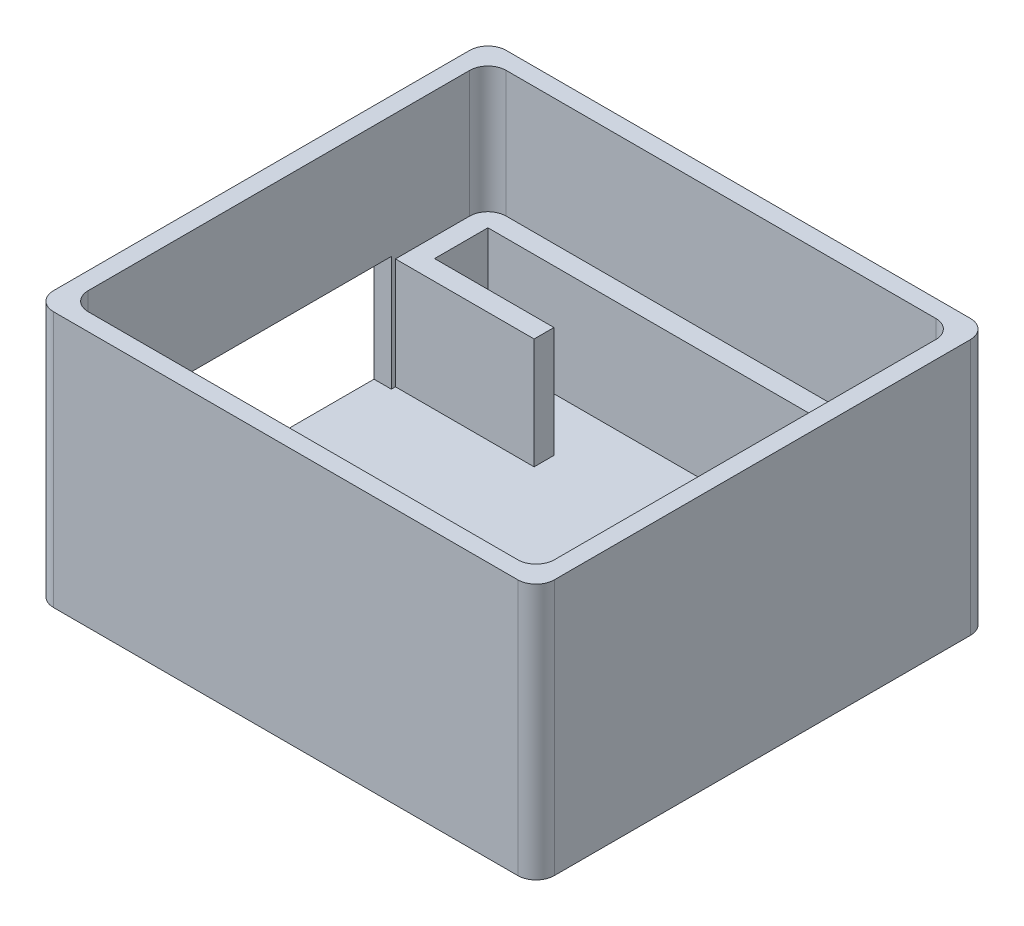
ISO-10303-21;
HEADER;
FILE_DESCRIPTION(('STEP AP214'),'2;1');
FILE_NAME('part.step','',(''),(''),'','','');
FILE_SCHEMA(('AUTOMOTIVE_DESIGN { 1 0 10303 214 1 1 1 1 }'));
ENDSEC;
DATA;
#1=APPLICATION_CONTEXT('core data for automotive mechanical design processes');
#2=APPLICATION_PROTOCOL_DEFINITION('international standard','automotive_design',2000,#1);
#3=PRODUCT_CONTEXT('',#1,'mechanical');
#4=PRODUCT('Part','Part','',(#3));
#5=PRODUCT_RELATED_PRODUCT_CATEGORY('part','',(#4));
#6=PRODUCT_DEFINITION_FORMATION('','',#4);
#7=PRODUCT_DEFINITION_CONTEXT('part definition',#1,'design');
#8=PRODUCT_DEFINITION('design','',#6,#7);
#9=PRODUCT_DEFINITION_SHAPE('','',#8);
#10=(LENGTH_UNIT() NAMED_UNIT(*) SI_UNIT(.MILLI.,.METRE.));
#11=(NAMED_UNIT(*) PLANE_ANGLE_UNIT() SI_UNIT($,.RADIAN.));
#12=(NAMED_UNIT(*) SI_UNIT($,.STERADIAN.) SOLID_ANGLE_UNIT());
#13=UNCERTAINTY_MEASURE_WITH_UNIT(LENGTH_MEASURE(1.E-05),#10,'distance_accuracy_value','');
#14=(GEOMETRIC_REPRESENTATION_CONTEXT(3) GLOBAL_UNCERTAINTY_ASSIGNED_CONTEXT((#13)) GLOBAL_UNIT_ASSIGNED_CONTEXT((#10,
#11,#12)) REPRESENTATION_CONTEXT('',''));
#15=CARTESIAN_POINT('',(0.,0.,0.));
#16=DIRECTION('',(0.,0.,1.));
#17=DIRECTION('',(1.,0.,0.));
#18=AXIS2_PLACEMENT_3D('',#15,#16,#17);
#19=CARTESIAN_POINT('',(0.,-2.3,0.));
#20=DIRECTION('',(0.,-1.,0.));
#21=DIRECTION('',(0.,0.,-1.));
#22=AXIS2_PLACEMENT_3D('',#19,#20,#21);
#23=PLANE('',#22);
#24=DIRECTION('',(1.,0.,0.));
#25=VECTOR('',#24,1.);
#26=CARTESIAN_POINT('',(0.,-2.3,-4.08189911136339));
#27=LINE('',#26,#25);
#28=CARTESIAN_POINT('',(-1.,-2.3,-4.08189911136339));
#29=VERTEX_POINT('',#28);
#30=CARTESIAN_POINT('',(7.1,-2.3,-4.08189911136339));
#31=VERTEX_POINT('',#30);
#32=EDGE_CURVE('E440',#29,#31,#27,.T.);
#33=ORIENTED_EDGE('',*,*,#32,.T.);
#34=DIRECTION('',(0.,0.,1.));
#35=VECTOR('',#34,1.);
#36=CARTESIAN_POINT('',(7.1,-2.3,-4.08189911136339));
#37=LINE('',#36,#35);
#38=CARTESIAN_POINT('',(7.1,-2.3,-3.08189911136339));
#39=VERTEX_POINT('',#38);
#40=EDGE_CURVE('E395',#31,#39,#37,.T.);
#41=ORIENTED_EDGE('',*,*,#40,.T.);
#42=DIRECTION('',(1.,0.,0.));
#43=VECTOR('',#42,1.);
#44=CARTESIAN_POINT('',(0.9,-2.3,-3.08189911136339));
#45=LINE('',#44,#43);
#46=CARTESIAN_POINT('',(0.9,-2.3,-3.08189911136339));
#47=VERTEX_POINT('',#46);
#48=EDGE_CURVE('E399',#47,#39,#45,.T.);
#49=ORIENTED_EDGE('',*,*,#48,.F.);
#50=DIRECTION('',(0.,0.,-1.));
#51=VECTOR('',#50,1.);
#52=CARTESIAN_POINT('',(0.9,-2.3,0.));
#53=LINE('',#52,#51);
#54=CARTESIAN_POINT('',(0.9,-2.3,-0.9));
#55=VERTEX_POINT('',#54);
#56=EDGE_CURVE('E551',#55,#47,#53,.T.);
#57=ORIENTED_EDGE('',*,*,#56,.F.);
#58=DIRECTION('',(1.,0.,0.));
#59=VECTOR('',#58,1.);
#60=CARTESIAN_POINT('',(0.,-2.3,-0.9));
#61=LINE('',#60,#59);
#62=CARTESIAN_POINT('',(23.1,-2.3,-0.9));
#63=VERTEX_POINT('',#62);
#64=EDGE_CURVE('E554',#55,#63,#61,.T.);
#65=ORIENTED_EDGE('',*,*,#64,.T.);
#66=DIRECTION('',(0.,0.,1.));
#67=VECTOR('',#66,1.);
#68=CARTESIAN_POINT('',(23.1,-2.3,0.));
#69=LINE('',#68,#67);
#70=CARTESIAN_POINT('',(23.1,-2.3,-20.6));
#71=VERTEX_POINT('',#70);
#72=EDGE_CURVE('E583',#71,#63,#69,.T.);
#73=ORIENTED_EDGE('',*,*,#72,.F.);
#74=DIRECTION('',(1.,0.,0.));
#75=VECTOR('',#74,1.);
#76=CARTESIAN_POINT('',(0.,-2.3,-20.6));
#77=LINE('',#76,#75);
#78=CARTESIAN_POINT('',(0.9,-2.3,-20.6));
#79=VERTEX_POINT('',#78);
#80=EDGE_CURVE('E581',#79,#71,#77,.T.);
#81=ORIENTED_EDGE('',*,*,#80,.F.);
#82=DIRECTION('',(0.,0.,1.));
#83=VECTOR('',#82,1.);
#84=CARTESIAN_POINT('',(0.9,-2.3,0.));
#85=LINE('',#84,#83);
#86=CARTESIAN_POINT('',(0.9,-2.3,-17.83));
#87=VERTEX_POINT('',#86);
#88=EDGE_CURVE('E578',#79,#87,#85,.T.);
#89=ORIENTED_EDGE('',*,*,#88,.T.);
#90=DIRECTION('',(1.,0.,0.));
#91=VECTOR('',#90,1.);
#92=CARTESIAN_POINT('',(0.9,-2.3,-17.83));
#93=LINE('',#92,#91);
#94=CARTESIAN_POINT('',(7.09724131044535,-2.3,-17.83));
#95=VERTEX_POINT('',#94);
#96=EDGE_CURVE('E382',#87,#95,#93,.T.);
#97=ORIENTED_EDGE('',*,*,#96,.T.);
#98=DIRECTION('',(0.,0.,-1.));
#99=VECTOR('',#98,1.);
#100=CARTESIAN_POINT('',(7.09724131044535,-2.3,-16.8));
#101=LINE('',#100,#99);
#102=CARTESIAN_POINT('',(7.09724131044535,-2.3,-16.8));
#103=VERTEX_POINT('',#102);
#104=EDGE_CURVE('E379',#103,#95,#101,.T.);
#105=ORIENTED_EDGE('',*,*,#104,.F.);
#106=DIRECTION('',(1.,0.,0.));
#107=VECTOR('',#106,1.);
#108=CARTESIAN_POINT('',(0.,-2.3,-16.8));
#109=LINE('',#108,#107);
#110=CARTESIAN_POINT('',(-0.1,-2.3,-16.8));
#111=VERTEX_POINT('',#110);
#112=EDGE_CURVE('E390',#111,#103,#109,.T.);
#113=ORIENTED_EDGE('',*,*,#112,.F.);
#114=DIRECTION('',(0.,0.,1.));
#115=VECTOR('',#114,1.);
#116=CARTESIAN_POINT('',(-0.1,-2.3,-21.6));
#117=LINE('',#116,#115);
#118=CARTESIAN_POINT('',(-0.1,-2.3,-16.586576073152));
#119=VERTEX_POINT('',#118);
#120=EDGE_CURVE('E365',#111,#119,#117,.T.);
#121=ORIENTED_EDGE('',*,*,#120,.T.);
#122=DIRECTION('',(-1.,0.,0.));
#123=VECTOR('',#122,1.);
#124=CARTESIAN_POINT('',(-1.,-2.3,-16.586576073152));
#125=LINE('',#124,#123);
#126=CARTESIAN_POINT('',(-1.,-2.3,-16.586576073152));
#127=VERTEX_POINT('',#126);
#128=EDGE_CURVE('E444',#119,#127,#125,.T.);
#129=ORIENTED_EDGE('',*,*,#128,.T.);
#130=DIRECTION('',(0.,0.,-1.));
#131=VECTOR('',#130,1.);
#132=CARTESIAN_POINT('',(-1.,-2.3,1.));
#133=LINE('',#132,#131);
#134=EDGE_CURVE('E427',#29,#127,#133,.T.);
#135=ORIENTED_EDGE('',*,*,#134,.F.);
#136=EDGE_LOOP('',(#33,#41,#49,#57,#65,#73,#81,#89,#97,#105,#113,#121,#129,#135));
#137=FACE_BOUND('',#136,.T.);
#138=ADVANCED_FACE('F135',(#137),#23,.F.);
#139=CARTESIAN_POINT('',(-0.1,-34.8043074068653,-21.6));
#140=DIRECTION('',(-1.,0.,0.));
#141=DIRECTION('',(0.,0.,1.));
#142=AXIS2_PLACEMENT_3D('',#139,#140,#141);
#143=PLANE('',#142);
#144=DIRECTION('',(0.,0.,1.));
#145=VECTOR('',#144,1.);
#146=CARTESIAN_POINT('',(-0.1,10.,-21.6));
#147=LINE('',#146,#145);
#148=CARTESIAN_POINT('',(-0.1,10.,-20.65));
#149=VERTEX_POINT('',#148);
#150=CARTESIAN_POINT('',(-0.1,10.,-0.85));
#151=VERTEX_POINT('',#150);
#152=EDGE_CURVE('E416',#149,#151,#147,.T.);
#153=ORIENTED_EDGE('',*,*,#152,.T.);
#154=DIRECTION('',(0.,1.,0.));
#155=VECTOR('',#154,1.);
#156=CARTESIAN_POINT('',(-0.1,3.45,-0.85));
#157=LINE('',#156,#155);
#158=CARTESIAN_POINT('',(-0.1,3.45,-0.85));
#159=VERTEX_POINT('',#158);
#160=EDGE_CURVE('E514',#151,#159,#157,.F.);
#161=ORIENTED_EDGE('',*,*,#160,.T.);
#162=DIRECTION('',(0.,0.,1.));
#163=VECTOR('',#162,1.);
#164=CARTESIAN_POINT('',(-0.1,3.45,0.));
#165=LINE('',#164,#163);
#166=CARTESIAN_POINT('',(-0.1,3.45,-4.08189911136339));
#167=VERTEX_POINT('',#166);
#168=EDGE_CURVE('E571',#167,#159,#165,.T.);
#169=ORIENTED_EDGE('',*,*,#168,.F.);
#170=DIRECTION('',(0.,-1.,0.));
#171=VECTOR('',#170,1.);
#172=CARTESIAN_POINT('',(-0.1,0.,-4.08189911136339));
#173=LINE('',#172,#171);
#174=CARTESIAN_POINT('',(-0.1,3.66933462960635,-4.08189911136339));
#175=VERTEX_POINT('',#174);
#176=EDGE_CURVE('E410',#175,#167,#173,.T.);
#177=ORIENTED_EDGE('',*,*,#176,.F.);
#178=DIRECTION('',(0.,0.,1.));
#179=VECTOR('',#178,1.);
#180=CARTESIAN_POINT('',(-0.1,3.66933462960635,-16.586576073152));
#181=LINE('',#180,#179);
#182=CARTESIAN_POINT('',(-0.1,3.66933462960635,-16.586576073152));
#183=VERTEX_POINT('',#182);
#184=EDGE_CURVE('E421',#183,#175,#181,.T.);
#185=ORIENTED_EDGE('',*,*,#184,.F.);
#186=DIRECTION('',(0.,1.,0.));
#187=VECTOR('',#186,1.);
#188=CARTESIAN_POINT('',(-0.1,0.,-16.586576073152));
#189=LINE('',#188,#187);
#190=EDGE_CURVE('E424',#119,#183,#189,.T.);
#191=ORIENTED_EDGE('',*,*,#190,.F.);
#192=ORIENTED_EDGE('',*,*,#120,.F.);
#193=DIRECTION('',(0.,-1.,0.));
#194=VECTOR('',#193,1.);
#195=CARTESIAN_POINT('',(-0.1,3.45,-16.8));
#196=LINE('',#195,#194);
#197=CARTESIAN_POINT('',(-0.1,3.45,-16.8));
#198=VERTEX_POINT('',#197);
#199=EDGE_CURVE('E354',#198,#111,#196,.T.);
#200=ORIENTED_EDGE('',*,*,#199,.F.);
#201=DIRECTION('',(0.,0.,1.));
#202=VECTOR('',#201,1.);
#203=CARTESIAN_POINT('',(-0.1,3.45,0.));
#204=LINE('',#203,#202);
#205=CARTESIAN_POINT('',(-0.1,3.45,-20.65));
#206=VERTEX_POINT('',#205);
#207=EDGE_CURVE('E337',#206,#198,#204,.T.);
#208=ORIENTED_EDGE('',*,*,#207,.F.);
#209=DIRECTION('',(0.,1.,0.));
#210=VECTOR('',#209,1.);
#211=CARTESIAN_POINT('',(-0.1,10.,-20.65));
#212=LINE('',#211,#210);
#213=EDGE_CURVE('E512',#206,#149,#212,.T.);
#214=ORIENTED_EDGE('',*,*,#213,.T.);
#215=EDGE_LOOP('',(#153,#161,#169,#177,#185,#191,#192,#200,#208,#214));
#216=FACE_BOUND('',#215,.T.);
#217=ADVANCED_FACE('F363',(#216),#143,.F.);
#218=CARTESIAN_POINT('',(0.,10.,0.));
#219=DIRECTION('',(0.,1.,0.));
#220=DIRECTION('',(0.,0.,1.));
#221=AXIS2_PLACEMENT_3D('',#218,#219,#220);
#222=PLANE('',#221);
#223=ORIENTED_EDGE('',*,*,#152,.F.);
#224=CARTESIAN_POINT('',(0.85,10.,-20.65));
#225=DIRECTION('',(0.,1.,0.));
#226=DIRECTION('',(0.,0.,1.));
#227=AXIS2_PLACEMENT_3D('',#224,#225,#226);
#228=CIRCLE('',#227,0.95);
#229=CARTESIAN_POINT('',(0.85,10.,-21.6));
#230=VERTEX_POINT('',#229);
#231=EDGE_CURVE('E12',#149,#230,#228,.F.);
#232=ORIENTED_EDGE('',*,*,#231,.T.);
#233=DIRECTION('',(-1.,0.,0.));
#234=VECTOR('',#233,1.);
#235=CARTESIAN_POINT('',(-0.1,10.,-21.6));
#236=LINE('',#235,#234);
#237=CARTESIAN_POINT('',(23.15,10.,-21.6));
#238=VERTEX_POINT('',#237);
#239=EDGE_CURVE('E407',#238,#230,#236,.T.);
#240=ORIENTED_EDGE('',*,*,#239,.F.);
#241=CARTESIAN_POINT('',(23.15,10.,-20.65));
#242=DIRECTION('',(0.,1.,0.));
#243=DIRECTION('',(0.,0.,1.));
#244=AXIS2_PLACEMENT_3D('',#241,#242,#243);
#245=CIRCLE('',#244,0.95);
#246=CARTESIAN_POINT('',(24.1,10.,-20.65));
#247=VERTEX_POINT('',#246);
#248=EDGE_CURVE('E143',#238,#247,#245,.F.);
#249=ORIENTED_EDGE('',*,*,#248,.T.);
#250=DIRECTION('',(0.,0.,-1.));
#251=VECTOR('',#250,1.);
#252=CARTESIAN_POINT('',(24.1,10.,-21.6));
#253=LINE('',#252,#251);
#254=CARTESIAN_POINT('',(24.1,10.,-0.85));
#255=VERTEX_POINT('',#254);
#256=EDGE_CURVE('E411',#255,#247,#253,.T.);
#257=ORIENTED_EDGE('',*,*,#256,.F.);
#258=CARTESIAN_POINT('',(23.15,10.,-0.85));
#259=DIRECTION('',(0.,1.,0.));
#260=DIRECTION('',(0.,0.,1.));
#261=AXIS2_PLACEMENT_3D('',#258,#259,#260);
#262=CIRCLE('',#261,0.95);
#263=CARTESIAN_POINT('',(23.15,10.,0.1));
#264=VERTEX_POINT('',#263);
#265=EDGE_CURVE('E533',#255,#264,#262,.F.);
#266=ORIENTED_EDGE('',*,*,#265,.T.);
#267=DIRECTION('',(1.,0.,0.));
#268=VECTOR('',#267,1.);
#269=CARTESIAN_POINT('',(-0.1,10.,0.1));
#270=LINE('',#269,#268);
#271=CARTESIAN_POINT('',(0.85,10.,0.1));
#272=VERTEX_POINT('',#271);
#273=EDGE_CURVE('E413',#272,#264,#270,.T.);
#274=ORIENTED_EDGE('',*,*,#273,.F.);
#275=CARTESIAN_POINT('',(0.85,10.,-0.85));
#276=DIRECTION('',(0.,1.,0.));
#277=DIRECTION('',(0.,0.,1.));
#278=AXIS2_PLACEMENT_3D('',#275,#276,#277);
#279=CIRCLE('',#278,0.95);
#280=EDGE_CURVE('E531',#272,#151,#279,.F.);
#281=ORIENTED_EDGE('',*,*,#280,.T.);
#282=EDGE_LOOP('',(#223,#232,#240,#249,#257,#266,#274,#281));
#283=FACE_BOUND('',#282,.T.);
#284=DIRECTION('',(1.,0.,0.));
#285=VECTOR('',#284,1.);
#286=CARTESIAN_POINT('',(-1.,10.,1.));
#287=LINE('',#286,#285);
#288=CARTESIAN_POINT('',(-0.05,10.,1.));
#289=VERTEX_POINT('',#288);
#290=CARTESIAN_POINT('',(24.05,10.,1.));
#291=VERTEX_POINT('',#290);
#292=EDGE_CURVE('E462',#289,#291,#287,.T.);
#293=ORIENTED_EDGE('',*,*,#292,.T.);
#294=CARTESIAN_POINT('',(24.05,10.,0.0500000000000014));
#295=DIRECTION('',(0.,1.,0.));
#296=DIRECTION('',(0.,0.,1.));
#297=AXIS2_PLACEMENT_3D('',#294,#295,#296);
#298=CIRCLE('',#297,0.95);
#299=CARTESIAN_POINT('',(25.,10.,0.0500000000000014));
#300=VERTEX_POINT('',#299);
#301=EDGE_CURVE('E495',#291,#300,#298,.T.);
#302=ORIENTED_EDGE('',*,*,#301,.T.);
#303=DIRECTION('',(0.,0.,-1.));
#304=VECTOR('',#303,1.);
#305=CARTESIAN_POINT('',(25.,10.,-22.5));
#306=LINE('',#305,#304);
#307=CARTESIAN_POINT('',(25.,10.,-21.55));
#308=VERTEX_POINT('',#307);
#309=EDGE_CURVE('E465',#300,#308,#306,.T.);
#310=ORIENTED_EDGE('',*,*,#309,.T.);
#311=CARTESIAN_POINT('',(24.05,10.,-21.55));
#312=DIRECTION('',(0.,1.,0.));
#313=DIRECTION('',(0.,0.,1.));
#314=AXIS2_PLACEMENT_3D('',#311,#312,#313);
#315=CIRCLE('',#314,0.95);
#316=CARTESIAN_POINT('',(24.05,10.,-22.5));
#317=VERTEX_POINT('',#316);
#318=EDGE_CURVE('E493',#308,#317,#315,.T.);
#319=ORIENTED_EDGE('',*,*,#318,.T.);
#320=DIRECTION('',(-1.,0.,0.));
#321=VECTOR('',#320,1.);
#322=CARTESIAN_POINT('',(-1.,10.,-22.5));
#323=LINE('',#322,#321);
#324=CARTESIAN_POINT('',(-0.05,10.,-22.5));
#325=VERTEX_POINT('',#324);
#326=EDGE_CURVE('E468',#317,#325,#323,.T.);
#327=ORIENTED_EDGE('',*,*,#326,.T.);
#328=CARTESIAN_POINT('',(-0.05,10.,-21.55));
#329=DIRECTION('',(0.,1.,0.));
#330=DIRECTION('',(0.,0.,1.));
#331=AXIS2_PLACEMENT_3D('',#328,#329,#330);
#332=CIRCLE('',#331,0.95);
#333=CARTESIAN_POINT('',(-1.,10.,-21.55));
#334=VERTEX_POINT('',#333);
#335=EDGE_CURVE('E491',#325,#334,#332,.T.);
#336=ORIENTED_EDGE('',*,*,#335,.T.);
#337=DIRECTION('',(0.,0.,1.));
#338=VECTOR('',#337,1.);
#339=CARTESIAN_POINT('',(-1.,10.,-22.5));
#340=LINE('',#339,#338);
#341=CARTESIAN_POINT('',(-1.,10.,0.0500000000000014));
#342=VERTEX_POINT('',#341);
#343=EDGE_CURVE('E458',#334,#342,#340,.T.);
#344=ORIENTED_EDGE('',*,*,#343,.T.);
#345=CARTESIAN_POINT('',(-0.05,10.,0.05));
#346=DIRECTION('',(0.,1.,0.));
#347=DIRECTION('',(0.,0.,1.));
#348=AXIS2_PLACEMENT_3D('',#345,#346,#347);
#349=CIRCLE('',#348,0.95);
#350=EDGE_CURVE('E489',#342,#289,#349,.T.);
#351=ORIENTED_EDGE('',*,*,#350,.T.);
#352=EDGE_LOOP('',(#293,#302,#310,#319,#327,#336,#344,#351));
#353=FACE_BOUND('',#352,.T.);
#354=ADVANCED_FACE('F538',(#283,#353),#222,.T.);
#355=CARTESIAN_POINT('',(-1.,10.,-22.5));
#356=DIRECTION('',(1.,0.,0.));
#357=DIRECTION('',(0.,0.,-1.));
#358=AXIS2_PLACEMENT_3D('',#355,#356,#357);
#359=PLANE('',#358);
#360=ORIENTED_EDGE('',*,*,#343,.F.);
#361=DIRECTION('',(0.,-1.,0.));
#362=VECTOR('',#361,1.);
#363=CARTESIAN_POINT('',(-1.,10.,-21.55));
#364=LINE('',#363,#362);
#365=CARTESIAN_POINT('',(-1.,-3.3,-21.55));
#366=VERTEX_POINT('',#365);
#367=EDGE_CURVE('E504',#334,#366,#364,.T.);
#368=ORIENTED_EDGE('',*,*,#367,.T.);
#369=DIRECTION('',(0.,0.,-1.));
#370=VECTOR('',#369,1.);
#371=CARTESIAN_POINT('',(-1.,-3.3,1.));
#372=LINE('',#371,#370);
#373=CARTESIAN_POINT('',(-1.,-3.3,0.05));
#374=VERTEX_POINT('',#373);
#375=EDGE_CURVE('E428',#374,#366,#372,.T.);
#376=ORIENTED_EDGE('',*,*,#375,.F.);
#377=DIRECTION('',(0.,-1.,0.));
#378=VECTOR('',#377,1.);
#379=CARTESIAN_POINT('',(-1.,10.,0.0500000000000014));
#380=LINE('',#379,#378);
#381=EDGE_CURVE('E502',#374,#342,#380,.F.);
#382=ORIENTED_EDGE('',*,*,#381,.T.);
#383=EDGE_LOOP('',(#360,#368,#376,#382));
#384=FACE_BOUND('',#383,.T.);
#385=ORIENTED_EDGE('',*,*,#134,.T.);
#386=DIRECTION('',(0.,-1.,0.));
#387=VECTOR('',#386,1.);
#388=CARTESIAN_POINT('',(-1.,0.,-16.586576073152));
#389=LINE('',#388,#387);
#390=CARTESIAN_POINT('',(-1.,3.66933462960635,-16.586576073152));
#391=VERTEX_POINT('',#390);
#392=EDGE_CURVE('E446',#391,#127,#389,.T.);
#393=ORIENTED_EDGE('',*,*,#392,.F.);
#394=DIRECTION('',(0.,0.,-1.));
#395=VECTOR('',#394,1.);
#396=CARTESIAN_POINT('',(-1.,3.66933462960635,-16.586576073152));
#397=LINE('',#396,#395);
#398=CARTESIAN_POINT('',(-1.,3.66933462960635,-4.08189911136339));
#399=VERTEX_POINT('',#398);
#400=EDGE_CURVE('E452',#399,#391,#397,.T.);
#401=ORIENTED_EDGE('',*,*,#400,.F.);
#402=DIRECTION('',(0.,1.,0.));
#403=VECTOR('',#402,1.);
#404=CARTESIAN_POINT('',(-1.,0.,-4.08189911136339));
#405=LINE('',#404,#403);
#406=EDGE_CURVE('E449',#29,#399,#405,.T.);
#407=ORIENTED_EDGE('',*,*,#406,.F.);
#408=EDGE_LOOP('',(#385,#393,#401,#407));
#409=FACE_BOUND('',#408,.T.);
#410=ADVANCED_FACE('F664',(#384,#409),#359,.F.);
#411=CARTESIAN_POINT('',(-1.,10.,1.));
#412=DIRECTION('',(0.,0.,-1.));
#413=DIRECTION('',(-1.,0.,0.));
#414=AXIS2_PLACEMENT_3D('',#411,#412,#413);
#415=PLANE('',#414);
#416=DIRECTION('',(-1.,0.,0.));
#417=VECTOR('',#416,1.);
#418=CARTESIAN_POINT('',(-1.,-3.3,1.));
#419=LINE('',#418,#417);
#420=CARTESIAN_POINT('',(24.05,-3.3,1.));
#421=VERTEX_POINT('',#420);
#422=CARTESIAN_POINT('',(-0.05,-3.3,1.));
#423=VERTEX_POINT('',#422);
#424=EDGE_CURVE('E437',#421,#423,#419,.T.);
#425=ORIENTED_EDGE('',*,*,#424,.F.);
#426=DIRECTION('',(0.,-1.,0.));
#427=VECTOR('',#426,1.);
#428=CARTESIAN_POINT('',(24.05,10.,1.));
#429=LINE('',#428,#427);
#430=EDGE_CURVE('E487',#421,#291,#429,.F.);
#431=ORIENTED_EDGE('',*,*,#430,.T.);
#432=ORIENTED_EDGE('',*,*,#292,.F.);
#433=DIRECTION('',(0.,-1.,0.));
#434=VECTOR('',#433,1.);
#435=CARTESIAN_POINT('',(-0.05,10.,1.));
#436=LINE('',#435,#434);
#437=EDGE_CURVE('E484',#289,#423,#436,.T.);
#438=ORIENTED_EDGE('',*,*,#437,.T.);
#439=EDGE_LOOP('',(#425,#431,#432,#438));
#440=FACE_BOUND('',#439,.T.);
#441=ADVANCED_FACE('F671',(#440),#415,.F.);
#442=CARTESIAN_POINT('',(25.,10.,-22.5));
#443=DIRECTION('',(-1.,0.,0.));
#444=DIRECTION('',(0.,0.,1.));
#445=AXIS2_PLACEMENT_3D('',#442,#443,#444);
#446=PLANE('',#445);
#447=ORIENTED_EDGE('',*,*,#309,.F.);
#448=DIRECTION('',(0.,-1.,0.));
#449=VECTOR('',#448,1.);
#450=CARTESIAN_POINT('',(25.,10.,0.0500000000000014));
#451=LINE('',#450,#449);
#452=CARTESIAN_POINT('',(25.,-3.3,0.0500000000000014));
#453=VERTEX_POINT('',#452);
#454=EDGE_CURVE('E473',#300,#453,#451,.T.);
#455=ORIENTED_EDGE('',*,*,#454,.T.);
#456=DIRECTION('',(0.,0.,1.));
#457=VECTOR('',#456,1.);
#458=CARTESIAN_POINT('',(25.,-3.3,1.));
#459=LINE('',#458,#457);
#460=CARTESIAN_POINT('',(25.,-3.3,-21.55));
#461=VERTEX_POINT('',#460);
#462=EDGE_CURVE('E434',#461,#453,#459,.T.);
#463=ORIENTED_EDGE('',*,*,#462,.F.);
#464=DIRECTION('',(0.,-1.,0.));
#465=VECTOR('',#464,1.);
#466=CARTESIAN_POINT('',(25.,10.,-21.55));
#467=LINE('',#466,#465);
#468=EDGE_CURVE('E471',#461,#308,#467,.F.);
#469=ORIENTED_EDGE('',*,*,#468,.T.);
#470=EDGE_LOOP('',(#447,#455,#463,#469));
#471=FACE_BOUND('',#470,.T.);
#472=ADVANCED_FACE('F667',(#471),#446,.F.);
#473=CARTESIAN_POINT('',(-1.,10.,-22.5));
#474=DIRECTION('',(0.,0.,1.));
#475=DIRECTION('',(1.,0.,0.));
#476=AXIS2_PLACEMENT_3D('',#473,#474,#475);
#477=PLANE('',#476);
#478=ORIENTED_EDGE('',*,*,#326,.F.);
#479=DIRECTION('',(0.,-1.,0.));
#480=VECTOR('',#479,1.);
#481=CARTESIAN_POINT('',(24.05,10.,-22.5));
#482=LINE('',#481,#480);
#483=CARTESIAN_POINT('',(24.05,-3.3,-22.5));
#484=VERTEX_POINT('',#483);
#485=EDGE_CURVE('E499',#317,#484,#482,.T.);
#486=ORIENTED_EDGE('',*,*,#485,.T.);
#487=DIRECTION('',(1.,0.,0.));
#488=VECTOR('',#487,1.);
#489=CARTESIAN_POINT('',(-1.,-3.3,-22.5));
#490=LINE('',#489,#488);
#491=CARTESIAN_POINT('',(-0.05,-3.3,-22.5));
#492=VERTEX_POINT('',#491);
#493=EDGE_CURVE('E431',#492,#484,#490,.T.);
#494=ORIENTED_EDGE('',*,*,#493,.F.);
#495=DIRECTION('',(0.,-1.,0.));
#496=VECTOR('',#495,1.);
#497=CARTESIAN_POINT('',(-0.05,10.,-22.5));
#498=LINE('',#497,#496);
#499=EDGE_CURVE('E497',#492,#325,#498,.F.);
#500=ORIENTED_EDGE('',*,*,#499,.T.);
#501=EDGE_LOOP('',(#478,#486,#494,#500));
#502=FACE_BOUND('',#501,.T.);
#503=ADVANCED_FACE('F660',(#502),#477,.F.);
#504=CARTESIAN_POINT('',(0.,0.,-16.586576073152));
#505=DIRECTION('',(0.,0.,-1.));
#506=DIRECTION('',(-1.,0.,0.));
#507=AXIS2_PLACEMENT_3D('',#504,#505,#506);
#508=PLANE('',#507);
#509=ORIENTED_EDGE('',*,*,#128,.F.);
#510=ORIENTED_EDGE('',*,*,#190,.T.);
#511=DIRECTION('',(-1.,0.,0.));
#512=VECTOR('',#511,1.);
#513=CARTESIAN_POINT('',(0.,3.66933462960635,-16.586576073152));
#514=LINE('',#513,#512);
#515=EDGE_CURVE('E456',#183,#391,#514,.T.);
#516=ORIENTED_EDGE('',*,*,#515,.T.);
#517=ORIENTED_EDGE('',*,*,#392,.T.);
#518=EDGE_LOOP('',(#509,#510,#516,#517));
#519=FACE_BOUND('',#518,.T.);
#520=ADVANCED_FACE('F653',(#519),#508,.F.);
#521=CARTESIAN_POINT('',(0.,3.66933462960635,-16.586576073152));
#522=DIRECTION('',(0.,1.,0.));
#523=DIRECTION('',(0.,0.,1.));
#524=AXIS2_PLACEMENT_3D('',#521,#522,#523);
#525=PLANE('',#524);
#526=ORIENTED_EDGE('',*,*,#515,.F.);
#527=ORIENTED_EDGE('',*,*,#184,.T.);
#528=DIRECTION('',(-1.,0.,0.));
#529=VECTOR('',#528,1.);
#530=CARTESIAN_POINT('',(0.,3.66933462960635,-4.08189911136339));
#531=LINE('',#530,#529);
#532=EDGE_CURVE('E455',#175,#399,#531,.T.);
#533=ORIENTED_EDGE('',*,*,#532,.T.);
#534=ORIENTED_EDGE('',*,*,#400,.T.);
#535=EDGE_LOOP('',(#526,#527,#533,#534));
#536=FACE_BOUND('',#535,.T.);
#537=ADVANCED_FACE('F649',(#536),#525,.F.);
#538=CARTESIAN_POINT('',(0.,0.,-4.08189911136339));
#539=DIRECTION('',(0.,0.,1.));
#540=DIRECTION('',(1.,0.,0.));
#541=AXIS2_PLACEMENT_3D('',#538,#539,#540);
#542=PLANE('',#541);
#543=ORIENTED_EDGE('',*,*,#532,.F.);
#544=ORIENTED_EDGE('',*,*,#176,.T.);
#545=DIRECTION('',(-1.,0.,0.));
#546=VECTOR('',#545,1.);
#547=CARTESIAN_POINT('',(0.,3.45,-4.08189911136339));
#548=LINE('',#547,#546);
#549=CARTESIAN_POINT('',(7.1,3.45,-4.08189911136339));
#550=VERTEX_POINT('',#549);
#551=EDGE_CURVE('E569',#550,#167,#548,.T.);
#552=ORIENTED_EDGE('',*,*,#551,.F.);
#553=DIRECTION('',(0.,-1.,0.));
#554=VECTOR('',#553,1.);
#555=CARTESIAN_POINT('',(7.1,3.45,-4.08189911136339));
#556=LINE('',#555,#554);
#557=EDGE_CURVE('E398',#550,#31,#556,.T.);
#558=ORIENTED_EDGE('',*,*,#557,.T.);
#559=ORIENTED_EDGE('',*,*,#32,.F.);
#560=ORIENTED_EDGE('',*,*,#406,.T.);
#561=EDGE_LOOP('',(#543,#544,#552,#558,#559,#560));
#562=FACE_BOUND('',#561,.T.);
#563=ADVANCED_FACE('F652',(#562),#542,.F.);
#564=CARTESIAN_POINT('',(0.,-3.3,0.));
#565=DIRECTION('',(0.,-1.,0.));
#566=DIRECTION('',(0.,0.,-1.));
#567=AXIS2_PLACEMENT_3D('',#564,#565,#566);
#568=PLANE('',#567);
#569=ORIENTED_EDGE('',*,*,#462,.T.);
#570=CARTESIAN_POINT('',(24.05,-3.3,0.0500000000000014));
#571=DIRECTION('',(0.,-1.,0.));
#572=DIRECTION('',(0.,0.,-1.));
#573=AXIS2_PLACEMENT_3D('',#570,#571,#572);
#574=CIRCLE('',#573,0.95);
#575=EDGE_CURVE('E482',#453,#421,#574,.T.);
#576=ORIENTED_EDGE('',*,*,#575,.T.);
#577=ORIENTED_EDGE('',*,*,#424,.T.);
#578=CARTESIAN_POINT('',(-0.05,-3.3,0.05));
#579=DIRECTION('',(0.,-1.,0.));
#580=DIRECTION('',(0.,0.,-1.));
#581=AXIS2_PLACEMENT_3D('',#578,#579,#580);
#582=CIRCLE('',#581,0.95);
#583=EDGE_CURVE('E476',#423,#374,#582,.T.);
#584=ORIENTED_EDGE('',*,*,#583,.T.);
#585=ORIENTED_EDGE('',*,*,#375,.T.);
#586=CARTESIAN_POINT('',(-0.05,-3.3,-21.55));
#587=DIRECTION('',(0.,-1.,0.));
#588=DIRECTION('',(0.,0.,-1.));
#589=AXIS2_PLACEMENT_3D('',#586,#587,#588);
#590=CIRCLE('',#589,0.95);
#591=EDGE_CURVE('E478',#366,#492,#590,.T.);
#592=ORIENTED_EDGE('',*,*,#591,.T.);
#593=ORIENTED_EDGE('',*,*,#493,.T.);
#594=CARTESIAN_POINT('',(24.05,-3.3,-21.55));
#595=DIRECTION('',(0.,-1.,0.));
#596=DIRECTION('',(0.,0.,-1.));
#597=AXIS2_PLACEMENT_3D('',#594,#595,#596);
#598=CIRCLE('',#597,0.95);
#599=EDGE_CURVE('E480',#484,#461,#598,.T.);
#600=ORIENTED_EDGE('',*,*,#599,.T.);
#601=EDGE_LOOP('',(#569,#576,#577,#584,#585,#592,#593,#600));
#602=FACE_BOUND('',#601,.T.);
#603=ADVANCED_FACE('F648',(#602),#568,.T.);
#604=CARTESIAN_POINT('',(-0.1,-34.8043074068653,-21.6));
#605=DIRECTION('',(0.,0.,-1.));
#606=DIRECTION('',(-1.,0.,0.));
#607=AXIS2_PLACEMENT_3D('',#604,#605,#606);
#608=PLANE('',#607);
#609=DIRECTION('',(-1.,0.,0.));
#610=VECTOR('',#609,1.);
#611=CARTESIAN_POINT('',(0.,3.45,-21.6));
#612=LINE('',#611,#610);
#613=CARTESIAN_POINT('',(23.15,3.45,-21.6));
#614=VERTEX_POINT('',#613);
#615=CARTESIAN_POINT('',(0.85,3.45,-21.6));
#616=VERTEX_POINT('',#615);
#617=EDGE_CURVE('E350',#614,#616,#612,.T.);
#618=ORIENTED_EDGE('',*,*,#617,.F.);
#619=DIRECTION('',(0.,1.,0.));
#620=VECTOR('',#619,1.);
#621=CARTESIAN_POINT('',(23.15,10.,-21.6));
#622=LINE('',#621,#620);
#623=EDGE_CURVE('E528',#614,#238,#622,.T.);
#624=ORIENTED_EDGE('',*,*,#623,.T.);
#625=ORIENTED_EDGE('',*,*,#239,.T.);
#626=DIRECTION('',(0.,1.,0.));
#627=VECTOR('',#626,1.);
#628=CARTESIAN_POINT('',(0.85,3.45,-21.6));
#629=LINE('',#628,#627);
#630=EDGE_CURVE('E526',#230,#616,#629,.F.);
#631=ORIENTED_EDGE('',*,*,#630,.T.);
#632=EDGE_LOOP('',(#618,#624,#625,#631));
#633=FACE_BOUND('',#632,.T.);
#634=ADVANCED_FACE('F549',(#633),#608,.F.);
#635=CARTESIAN_POINT('',(24.1,-34.8043074068653,-21.6));
#636=DIRECTION('',(1.,0.,0.));
#637=DIRECTION('',(0.,0.,-1.));
#638=AXIS2_PLACEMENT_3D('',#635,#636,#637);
#639=PLANE('',#638);
#640=DIRECTION('',(0.,0.,-1.));
#641=VECTOR('',#640,1.);
#642=CARTESIAN_POINT('',(24.1,3.45,0.));
#643=LINE('',#642,#641);
#644=CARTESIAN_POINT('',(24.1,3.45,-0.85));
#645=VERTEX_POINT('',#644);
#646=CARTESIAN_POINT('',(24.1,3.45,-20.65));
#647=VERTEX_POINT('',#646);
#648=EDGE_CURVE('E547',#645,#647,#643,.T.);
#649=ORIENTED_EDGE('',*,*,#648,.F.);
#650=DIRECTION('',(0.,1.,0.));
#651=VECTOR('',#650,1.);
#652=CARTESIAN_POINT('',(24.1,10.,-0.85));
#653=LINE('',#652,#651);
#654=EDGE_CURVE('E523',#645,#255,#653,.T.);
#655=ORIENTED_EDGE('',*,*,#654,.T.);
#656=ORIENTED_EDGE('',*,*,#256,.T.);
#657=DIRECTION('',(0.,1.,0.));
#658=VECTOR('',#657,1.);
#659=CARTESIAN_POINT('',(24.1,3.45,-20.65));
#660=LINE('',#659,#658);
#661=EDGE_CURVE('E150',#247,#647,#660,.F.);
#662=ORIENTED_EDGE('',*,*,#661,.T.);
#663=EDGE_LOOP('',(#649,#655,#656,#662));
#664=FACE_BOUND('',#663,.T.);
#665=ADVANCED_FACE('F542',(#664),#639,.F.);
#666=CARTESIAN_POINT('',(-0.1,-34.8043074068653,0.1));
#667=DIRECTION('',(0.,0.,1.));
#668=DIRECTION('',(1.,0.,0.));
#669=AXIS2_PLACEMENT_3D('',#666,#667,#668);
#670=PLANE('',#669);
#671=DIRECTION('',(1.,0.,0.));
#672=VECTOR('',#671,1.);
#673=CARTESIAN_POINT('',(0.,3.45,0.1));
#674=LINE('',#673,#672);
#675=CARTESIAN_POINT('',(0.85,3.45,0.1));
#676=VERTEX_POINT('',#675);
#677=CARTESIAN_POINT('',(23.15,3.45,0.1));
#678=VERTEX_POINT('',#677);
#679=EDGE_CURVE('E573',#676,#678,#674,.T.);
#680=ORIENTED_EDGE('',*,*,#679,.F.);
#681=DIRECTION('',(0.,1.,0.));
#682=VECTOR('',#681,1.);
#683=CARTESIAN_POINT('',(0.85,10.,0.1));
#684=LINE('',#683,#682);
#685=EDGE_CURVE('E509',#676,#272,#684,.T.);
#686=ORIENTED_EDGE('',*,*,#685,.T.);
#687=ORIENTED_EDGE('',*,*,#273,.T.);
#688=DIRECTION('',(0.,1.,0.));
#689=VECTOR('',#688,1.);
#690=CARTESIAN_POINT('',(23.15,3.45,0.1));
#691=LINE('',#690,#689);
#692=EDGE_CURVE('E507',#264,#678,#691,.F.);
#693=ORIENTED_EDGE('',*,*,#692,.T.);
#694=EDGE_LOOP('',(#680,#686,#687,#693));
#695=FACE_BOUND('',#694,.T.);
#696=ADVANCED_FACE('F633',(#695),#670,.F.);
#697=CARTESIAN_POINT('',(0.,3.45,-16.8));
#698=DIRECTION('',(0.,0.,-1.));
#699=DIRECTION('',(-1.,0.,0.));
#700=AXIS2_PLACEMENT_3D('',#697,#698,#699);
#701=PLANE('',#700);
#702=ORIENTED_EDGE('',*,*,#112,.T.);
#703=DIRECTION('',(0.,-1.,0.));
#704=VECTOR('',#703,1.);
#705=CARTESIAN_POINT('',(7.09724131044535,3.45,-16.8));
#706=LINE('',#705,#704);
#707=CARTESIAN_POINT('',(7.09724131044535,3.45,-16.8));
#708=VERTEX_POINT('',#707);
#709=EDGE_CURVE('E357',#708,#103,#706,.T.);
#710=ORIENTED_EDGE('',*,*,#709,.F.);
#711=DIRECTION('',(1.,0.,0.));
#712=VECTOR('',#711,1.);
#713=CARTESIAN_POINT('',(0.,3.45,-16.8));
#714=LINE('',#713,#712);
#715=EDGE_CURVE('E341',#198,#708,#714,.T.);
#716=ORIENTED_EDGE('',*,*,#715,.F.);
#717=ORIENTED_EDGE('',*,*,#199,.T.);
#718=EDGE_LOOP('',(#702,#710,#716,#717));
#719=FACE_BOUND('',#718,.T.);
#720=ADVANCED_FACE('F353',(#719),#701,.F.);
#721=CARTESIAN_POINT('',(0.9,3.45,0.));
#722=DIRECTION('',(1.,0.,0.));
#723=DIRECTION('',(0.,0.,-1.));
#724=AXIS2_PLACEMENT_3D('',#721,#722,#723);
#725=PLANE('',#724);
#726=DIRECTION('',(0.,0.,1.));
#727=VECTOR('',#726,1.);
#728=CARTESIAN_POINT('',(0.9,3.45,0.));
#729=LINE('',#728,#727);
#730=CARTESIAN_POINT('',(0.9,3.45,-20.6));
#731=VERTEX_POINT('',#730);
#732=CARTESIAN_POINT('',(0.9,3.45,-17.83));
#733=VERTEX_POINT('',#732);
#734=EDGE_CURVE('E359',#731,#733,#729,.T.);
#735=ORIENTED_EDGE('',*,*,#734,.T.);
#736=DIRECTION('',(0.,-1.,0.));
#737=VECTOR('',#736,1.);
#738=CARTESIAN_POINT('',(0.9,3.45,-17.83));
#739=LINE('',#738,#737);
#740=EDGE_CURVE('E369',#733,#87,#739,.T.);
#741=ORIENTED_EDGE('',*,*,#740,.T.);
#742=ORIENTED_EDGE('',*,*,#88,.F.);
#743=DIRECTION('',(0.,-1.,0.));
#744=VECTOR('',#743,1.);
#745=CARTESIAN_POINT('',(0.9,3.45,-20.6));
#746=LINE('',#745,#744);
#747=EDGE_CURVE('E367',#731,#79,#746,.T.);
#748=ORIENTED_EDGE('',*,*,#747,.F.);
#749=EDGE_LOOP('',(#735,#741,#742,#748));
#750=FACE_BOUND('',#749,.T.);
#751=ADVANCED_FACE('F613',(#750),#725,.T.);
#752=CARTESIAN_POINT('',(0.,3.45,-20.6));
#753=DIRECTION('',(0.,0.,-1.));
#754=DIRECTION('',(-1.,0.,0.));
#755=AXIS2_PLACEMENT_3D('',#752,#753,#754);
#756=PLANE('',#755);
#757=ORIENTED_EDGE('',*,*,#80,.T.);
#758=DIRECTION('',(0.,-1.,0.));
#759=VECTOR('',#758,1.);
#760=CARTESIAN_POINT('',(23.1,3.45,-20.6));
#761=LINE('',#760,#759);
#762=CARTESIAN_POINT('',(23.1,3.45,-20.6));
#763=VERTEX_POINT('',#762);
#764=EDGE_CURVE('E371',#763,#71,#761,.T.);
#765=ORIENTED_EDGE('',*,*,#764,.F.);
#766=DIRECTION('',(1.,0.,0.));
#767=VECTOR('',#766,1.);
#768=CARTESIAN_POINT('',(0.,3.45,-20.6));
#769=LINE('',#768,#767);
#770=EDGE_CURVE('E559',#731,#763,#769,.T.);
#771=ORIENTED_EDGE('',*,*,#770,.F.);
#772=ORIENTED_EDGE('',*,*,#747,.T.);
#773=EDGE_LOOP('',(#757,#765,#771,#772));
#774=FACE_BOUND('',#773,.T.);
#775=ADVANCED_FACE('F610',(#774),#756,.F.);
#776=CARTESIAN_POINT('',(23.1,3.45,0.));
#777=DIRECTION('',(1.,0.,0.));
#778=DIRECTION('',(0.,0.,-1.));
#779=AXIS2_PLACEMENT_3D('',#776,#777,#778);
#780=PLANE('',#779);
#781=ORIENTED_EDGE('',*,*,#72,.T.);
#782=DIRECTION('',(0.,-1.,0.));
#783=VECTOR('',#782,1.);
#784=CARTESIAN_POINT('',(23.1,3.45,-0.9));
#785=LINE('',#784,#783);
#786=CARTESIAN_POINT('',(23.1,3.45,-0.9));
#787=VERTEX_POINT('',#786);
#788=EDGE_CURVE('E589',#787,#63,#785,.T.);
#789=ORIENTED_EDGE('',*,*,#788,.F.);
#790=DIRECTION('',(0.,0.,1.));
#791=VECTOR('',#790,1.);
#792=CARTESIAN_POINT('',(23.1,3.45,0.));
#793=LINE('',#792,#791);
#794=EDGE_CURVE('E561',#763,#787,#793,.T.);
#795=ORIENTED_EDGE('',*,*,#794,.F.);
#796=ORIENTED_EDGE('',*,*,#764,.T.);
#797=EDGE_LOOP('',(#781,#789,#795,#796));
#798=FACE_BOUND('',#797,.T.);
#799=ADVANCED_FACE('F595',(#798),#780,.F.);
#800=CARTESIAN_POINT('',(0.,3.45,-0.9));
#801=DIRECTION('',(0.,0.,-1.));
#802=DIRECTION('',(-1.,0.,0.));
#803=AXIS2_PLACEMENT_3D('',#800,#801,#802);
#804=PLANE('',#803);
#805=ORIENTED_EDGE('',*,*,#64,.F.);
#806=DIRECTION('',(0.,-1.,0.));
#807=VECTOR('',#806,1.);
#808=CARTESIAN_POINT('',(0.9,3.45,-0.9));
#809=LINE('',#808,#807);
#810=CARTESIAN_POINT('',(0.9,3.45,-0.9));
#811=VERTEX_POINT('',#810);
#812=EDGE_CURVE('E576',#811,#55,#809,.T.);
#813=ORIENTED_EDGE('',*,*,#812,.F.);
#814=DIRECTION('',(1.,0.,0.));
#815=VECTOR('',#814,1.);
#816=CARTESIAN_POINT('',(0.,3.45,-0.9));
#817=LINE('',#816,#815);
#818=EDGE_CURVE('E563',#811,#787,#817,.T.);
#819=ORIENTED_EDGE('',*,*,#818,.T.);
#820=ORIENTED_EDGE('',*,*,#788,.T.);
#821=EDGE_LOOP('',(#805,#813,#819,#820));
#822=FACE_BOUND('',#821,.T.);
#823=ADVANCED_FACE('F605',(#822),#804,.T.);
#824=CARTESIAN_POINT('',(0.9,3.45,0.));
#825=DIRECTION('',(-1.,0.,0.));
#826=DIRECTION('',(0.,0.,1.));
#827=AXIS2_PLACEMENT_3D('',#824,#825,#826);
#828=PLANE('',#827);
#829=DIRECTION('',(0.,-1.,0.));
#830=VECTOR('',#829,1.);
#831=CARTESIAN_POINT('',(0.9,3.45,-3.08189911136339));
#832=LINE('',#831,#830);
#833=CARTESIAN_POINT('',(0.9,3.45,-3.08189911136339));
#834=VERTEX_POINT('',#833);
#835=EDGE_CURVE('E366',#834,#47,#832,.T.);
#836=ORIENTED_EDGE('',*,*,#835,.F.);
#837=DIRECTION('',(0.,0.,-1.));
#838=VECTOR('',#837,1.);
#839=CARTESIAN_POINT('',(0.9,3.45,0.));
#840=LINE('',#839,#838);
#841=EDGE_CURVE('E566',#811,#834,#840,.T.);
#842=ORIENTED_EDGE('',*,*,#841,.F.);
#843=ORIENTED_EDGE('',*,*,#812,.T.);
#844=ORIENTED_EDGE('',*,*,#56,.T.);
#845=EDGE_LOOP('',(#836,#842,#843,#844));
#846=FACE_BOUND('',#845,.T.);
#847=ADVANCED_FACE('F727',(#846),#828,.F.);
#848=CARTESIAN_POINT('',(0.,3.45,0.));
#849=DIRECTION('',(0.,1.,0.));
#850=DIRECTION('',(0.,0.,1.));
#851=AXIS2_PLACEMENT_3D('',#848,#849,#850);
#852=PLANE('',#851);
#853=ORIENTED_EDGE('',*,*,#168,.T.);
#854=CARTESIAN_POINT('',(0.85,3.45,-0.85));
#855=DIRECTION('',(0.,1.,0.));
#856=DIRECTION('',(0.,0.,1.));
#857=AXIS2_PLACEMENT_3D('',#854,#855,#856);
#858=CIRCLE('',#857,0.95);
#859=EDGE_CURVE('E520',#159,#676,#858,.T.);
#860=ORIENTED_EDGE('',*,*,#859,.T.);
#861=ORIENTED_EDGE('',*,*,#679,.T.);
#862=CARTESIAN_POINT('',(23.15,3.45,-0.85));
#863=DIRECTION('',(0.,1.,0.));
#864=DIRECTION('',(0.,0.,1.));
#865=AXIS2_PLACEMENT_3D('',#862,#863,#864);
#866=CIRCLE('',#865,0.95);
#867=EDGE_CURVE('E157',#678,#645,#866,.T.);
#868=ORIENTED_EDGE('',*,*,#867,.T.);
#869=ORIENTED_EDGE('',*,*,#648,.T.);
#870=CARTESIAN_POINT('',(23.15,3.45,-20.65));
#871=DIRECTION('',(0.,1.,0.));
#872=DIRECTION('',(0.,0.,1.));
#873=AXIS2_PLACEMENT_3D('',#870,#871,#872);
#874=CIRCLE('',#873,0.95);
#875=EDGE_CURVE('E517',#647,#614,#874,.T.);
#876=ORIENTED_EDGE('',*,*,#875,.T.);
#877=ORIENTED_EDGE('',*,*,#617,.T.);
#878=CARTESIAN_POINT('',(0.85,3.45,-20.65));
#879=DIRECTION('',(0.,1.,0.));
#880=DIRECTION('',(0.,0.,1.));
#881=AXIS2_PLACEMENT_3D('',#878,#879,#880);
#882=CIRCLE('',#881,0.95);
#883=EDGE_CURVE('E345',#616,#206,#882,.T.);
#884=ORIENTED_EDGE('',*,*,#883,.T.);
#885=ORIENTED_EDGE('',*,*,#207,.T.);
#886=ORIENTED_EDGE('',*,*,#715,.T.);
#887=DIRECTION('',(0.,0.,-1.));
#888=VECTOR('',#887,1.);
#889=CARTESIAN_POINT('',(7.09724131044535,3.45,-16.8));
#890=LINE('',#889,#888);
#891=CARTESIAN_POINT('',(7.09724131044535,3.45,-17.83));
#892=VERTEX_POINT('',#891);
#893=EDGE_CURVE('E378',#708,#892,#890,.T.);
#894=ORIENTED_EDGE('',*,*,#893,.T.);
#895=DIRECTION('',(1.,0.,0.));
#896=VECTOR('',#895,1.);
#897=CARTESIAN_POINT('',(0.9,3.45,-17.83));
#898=LINE('',#897,#896);
#899=EDGE_CURVE('E375',#733,#892,#898,.T.);
#900=ORIENTED_EDGE('',*,*,#899,.F.);
#901=ORIENTED_EDGE('',*,*,#734,.F.);
#902=ORIENTED_EDGE('',*,*,#770,.T.);
#903=ORIENTED_EDGE('',*,*,#794,.T.);
#904=ORIENTED_EDGE('',*,*,#818,.F.);
#905=ORIENTED_EDGE('',*,*,#841,.T.);
#906=DIRECTION('',(1.,0.,0.));
#907=VECTOR('',#906,1.);
#908=CARTESIAN_POINT('',(0.9,3.45,-3.08189911136339));
#909=LINE('',#908,#907);
#910=CARTESIAN_POINT('',(7.1,3.45,-3.08189911136339));
#911=VERTEX_POINT('',#910);
#912=EDGE_CURVE('E392',#834,#911,#909,.T.);
#913=ORIENTED_EDGE('',*,*,#912,.T.);
#914=DIRECTION('',(0.,0.,1.));
#915=VECTOR('',#914,1.);
#916=CARTESIAN_POINT('',(7.1,3.45,-4.08189911136339));
#917=LINE('',#916,#915);
#918=EDGE_CURVE('E394',#550,#911,#917,.T.);
#919=ORIENTED_EDGE('',*,*,#918,.F.);
#920=ORIENTED_EDGE('',*,*,#551,.T.);
#921=EDGE_LOOP('',(#853,#860,#861,#868,#869,#876,#877,#884,#885,#886,#894,#900,#901,#902,#903,
#904,#905,#913,#919,#920));
#922=FACE_BOUND('',#921,.T.);
#923=ADVANCED_FACE('F340',(#922),#852,.T.);
#924=CARTESIAN_POINT('',(7.1,3.45,-4.08189911136339));
#925=DIRECTION('',(1.,0.,0.));
#926=DIRECTION('',(0.,0.,-1.));
#927=AXIS2_PLACEMENT_3D('',#924,#925,#926);
#928=PLANE('',#927);
#929=ORIENTED_EDGE('',*,*,#40,.F.);
#930=ORIENTED_EDGE('',*,*,#557,.F.);
#931=ORIENTED_EDGE('',*,*,#918,.T.);
#932=DIRECTION('',(0.,-1.,0.));
#933=VECTOR('',#932,1.);
#934=CARTESIAN_POINT('',(7.1,3.45,-3.08189911136339));
#935=LINE('',#934,#933);
#936=EDGE_CURVE('E385',#911,#39,#935,.T.);
#937=ORIENTED_EDGE('',*,*,#936,.T.);
#938=EDGE_LOOP('',(#929,#930,#931,#937));
#939=FACE_BOUND('',#938,.T.);
#940=ADVANCED_FACE('F630',(#939),#928,.T.);
#941=CARTESIAN_POINT('',(0.9,3.45,-3.08189911136339));
#942=DIRECTION('',(0.,0.,-1.));
#943=DIRECTION('',(-1.,0.,0.));
#944=AXIS2_PLACEMENT_3D('',#941,#942,#943);
#945=PLANE('',#944);
#946=ORIENTED_EDGE('',*,*,#48,.T.);
#947=ORIENTED_EDGE('',*,*,#936,.F.);
#948=ORIENTED_EDGE('',*,*,#912,.F.);
#949=ORIENTED_EDGE('',*,*,#835,.T.);
#950=EDGE_LOOP('',(#946,#947,#948,#949));
#951=FACE_BOUND('',#950,.T.);
#952=ADVANCED_FACE('F622',(#951),#945,.F.);
#953=CARTESIAN_POINT('',(7.09724131044535,3.45,-16.8));
#954=DIRECTION('',(-1.,0.,0.));
#955=DIRECTION('',(0.,0.,1.));
#956=AXIS2_PLACEMENT_3D('',#953,#954,#955);
#957=PLANE('',#956);
#958=ORIENTED_EDGE('',*,*,#104,.T.);
#959=DIRECTION('',(0.,-1.,0.));
#960=VECTOR('',#959,1.);
#961=CARTESIAN_POINT('',(7.09724131044535,3.45,-17.83));
#962=LINE('',#961,#960);
#963=EDGE_CURVE('E381',#892,#95,#962,.T.);
#964=ORIENTED_EDGE('',*,*,#963,.F.);
#965=ORIENTED_EDGE('',*,*,#893,.F.);
#966=ORIENTED_EDGE('',*,*,#709,.T.);
#967=EDGE_LOOP('',(#958,#964,#965,#966));
#968=FACE_BOUND('',#967,.T.);
#969=ADVANCED_FACE('F620',(#968),#957,.F.);
#970=CARTESIAN_POINT('',(0.9,3.45,-17.83));
#971=DIRECTION('',(0.,0.,-1.));
#972=DIRECTION('',(-1.,0.,0.));
#973=AXIS2_PLACEMENT_3D('',#970,#971,#972);
#974=PLANE('',#973);
#975=ORIENTED_EDGE('',*,*,#96,.F.);
#976=ORIENTED_EDGE('',*,*,#740,.F.);
#977=ORIENTED_EDGE('',*,*,#899,.T.);
#978=ORIENTED_EDGE('',*,*,#963,.T.);
#979=EDGE_LOOP('',(#975,#976,#977,#978));
#980=FACE_BOUND('',#979,.T.);
#981=ADVANCED_FACE('F617',(#980),#974,.T.);
#982=CARTESIAN_POINT('',(24.05,10.,0.0500000000000014));
#983=DIRECTION('',(0.,-1.,0.));
#984=DIRECTION('',(0.,0.,-1.));
#985=AXIS2_PLACEMENT_3D('',#982,#983,#984);
#986=CYLINDRICAL_SURFACE('',#985,0.95);
#987=ORIENTED_EDGE('',*,*,#301,.F.);
#988=ORIENTED_EDGE('',*,*,#430,.F.);
#989=ORIENTED_EDGE('',*,*,#575,.F.);
#990=ORIENTED_EDGE('',*,*,#454,.F.);
#991=EDGE_LOOP('',(#987,#988,#989,#990));
#992=FACE_BOUND('',#991,.T.);
#993=ADVANCED_FACE('F624',(#992),#986,.T.);
#994=CARTESIAN_POINT('',(24.05,10.,-21.55));
#995=DIRECTION('',(0.,-1.,0.));
#996=DIRECTION('',(0.,0.,-1.));
#997=AXIS2_PLACEMENT_3D('',#994,#995,#996);
#998=CYLINDRICAL_SURFACE('',#997,0.95);
#999=ORIENTED_EDGE('',*,*,#318,.F.);
#1000=ORIENTED_EDGE('',*,*,#468,.F.);
#1001=ORIENTED_EDGE('',*,*,#599,.F.);
#1002=ORIENTED_EDGE('',*,*,#485,.F.);
#1003=EDGE_LOOP('',(#999,#1000,#1001,#1002));
#1004=FACE_BOUND('',#1003,.T.);
#1005=ADVANCED_FACE('F636',(#1004),#998,.T.);
#1006=CARTESIAN_POINT('',(-0.05,10.,-21.55));
#1007=DIRECTION('',(0.,-1.,0.));
#1008=DIRECTION('',(0.,0.,-1.));
#1009=AXIS2_PLACEMENT_3D('',#1006,#1007,#1008);
#1010=CYLINDRICAL_SURFACE('',#1009,0.95);
#1011=ORIENTED_EDGE('',*,*,#335,.F.);
#1012=ORIENTED_EDGE('',*,*,#499,.F.);
#1013=ORIENTED_EDGE('',*,*,#591,.F.);
#1014=ORIENTED_EDGE('',*,*,#367,.F.);
#1015=EDGE_LOOP('',(#1011,#1012,#1013,#1014));
#1016=FACE_BOUND('',#1015,.T.);
#1017=ADVANCED_FACE('F681',(#1016),#1010,.T.);
#1018=CARTESIAN_POINT('',(-0.05,10.,0.05));
#1019=DIRECTION('',(0.,-1.,0.));
#1020=DIRECTION('',(0.,0.,-1.));
#1021=AXIS2_PLACEMENT_3D('',#1018,#1019,#1020);
#1022=CYLINDRICAL_SURFACE('',#1021,0.95);
#1023=ORIENTED_EDGE('',*,*,#350,.F.);
#1024=ORIENTED_EDGE('',*,*,#381,.F.);
#1025=ORIENTED_EDGE('',*,*,#583,.F.);
#1026=ORIENTED_EDGE('',*,*,#437,.F.);
#1027=EDGE_LOOP('',(#1023,#1024,#1025,#1026));
#1028=FACE_BOUND('',#1027,.T.);
#1029=ADVANCED_FACE('F685',(#1028),#1022,.T.);
#1030=CARTESIAN_POINT('',(0.85,-34.8043074068653,-0.85));
#1031=DIRECTION('',(0.,-1.,0.));
#1032=DIRECTION('',(0.,0.,-1.));
#1033=AXIS2_PLACEMENT_3D('',#1030,#1031,#1032);
#1034=CYLINDRICAL_SURFACE('',#1033,0.95);
#1035=ORIENTED_EDGE('',*,*,#859,.F.);
#1036=ORIENTED_EDGE('',*,*,#160,.F.);
#1037=ORIENTED_EDGE('',*,*,#280,.F.);
#1038=ORIENTED_EDGE('',*,*,#685,.F.);
#1039=EDGE_LOOP('',(#1035,#1036,#1037,#1038));
#1040=FACE_BOUND('',#1039,.T.);
#1041=ADVANCED_FACE('F689',(#1040),#1034,.F.);
#1042=CARTESIAN_POINT('',(23.15,-34.8043074068653,-0.85));
#1043=DIRECTION('',(0.,-1.,0.));
#1044=DIRECTION('',(0.,0.,-1.));
#1045=AXIS2_PLACEMENT_3D('',#1042,#1043,#1044);
#1046=CYLINDRICAL_SURFACE('',#1045,0.95);
#1047=ORIENTED_EDGE('',*,*,#867,.F.);
#1048=ORIENTED_EDGE('',*,*,#692,.F.);
#1049=ORIENTED_EDGE('',*,*,#265,.F.);
#1050=ORIENTED_EDGE('',*,*,#654,.F.);
#1051=EDGE_LOOP('',(#1047,#1048,#1049,#1050));
#1052=FACE_BOUND('',#1051,.T.);
#1053=ADVANCED_FACE('F693',(#1052),#1046,.F.);
#1054=CARTESIAN_POINT('',(23.15,-34.8043074068653,-20.65));
#1055=DIRECTION('',(0.,-1.,0.));
#1056=DIRECTION('',(0.,0.,-1.));
#1057=AXIS2_PLACEMENT_3D('',#1054,#1055,#1056);
#1058=CYLINDRICAL_SURFACE('',#1057,0.95);
#1059=ORIENTED_EDGE('',*,*,#875,.F.);
#1060=ORIENTED_EDGE('',*,*,#661,.F.);
#1061=ORIENTED_EDGE('',*,*,#248,.F.);
#1062=ORIENTED_EDGE('',*,*,#623,.F.);
#1063=EDGE_LOOP('',(#1059,#1060,#1061,#1062));
#1064=FACE_BOUND('',#1063,.T.);
#1065=ADVANCED_FACE('F545',(#1064),#1058,.F.);
#1066=CARTESIAN_POINT('',(0.85,-34.8043074068653,-20.65));
#1067=DIRECTION('',(0.,-1.,0.));
#1068=DIRECTION('',(0.,0.,-1.));
#1069=AXIS2_PLACEMENT_3D('',#1066,#1067,#1068);
#1070=CYLINDRICAL_SURFACE('',#1069,0.95);
#1071=ORIENTED_EDGE('',*,*,#883,.F.);
#1072=ORIENTED_EDGE('',*,*,#630,.F.);
#1073=ORIENTED_EDGE('',*,*,#231,.F.);
#1074=ORIENTED_EDGE('',*,*,#213,.F.);
#1075=EDGE_LOOP('',(#1071,#1072,#1073,#1074));
#1076=FACE_BOUND('',#1075,.T.);
#1077=ADVANCED_FACE('F137',(#1076),#1070,.F.);
#1078=CLOSED_SHELL('',(#138,#217,#354,#410,#441,#472,#503,#520,#537,#563,#603,#634,#665,#696,
#720,#751,#775,#799,#823,#847,#923,#940,#952,#969,#981,#993,#1005,#1017,#1029,#1041,#1053,#1065,#1077));
#1079=MANIFOLD_SOLID_BREP('B2',#1078);
#1080=ADVANCED_BREP_SHAPE_REPRESENTATION('',(#18,#1079),#14);
#1081=SHAPE_DEFINITION_REPRESENTATION(#9,#1080);
ENDSEC;
END-ISO-10303-21;
